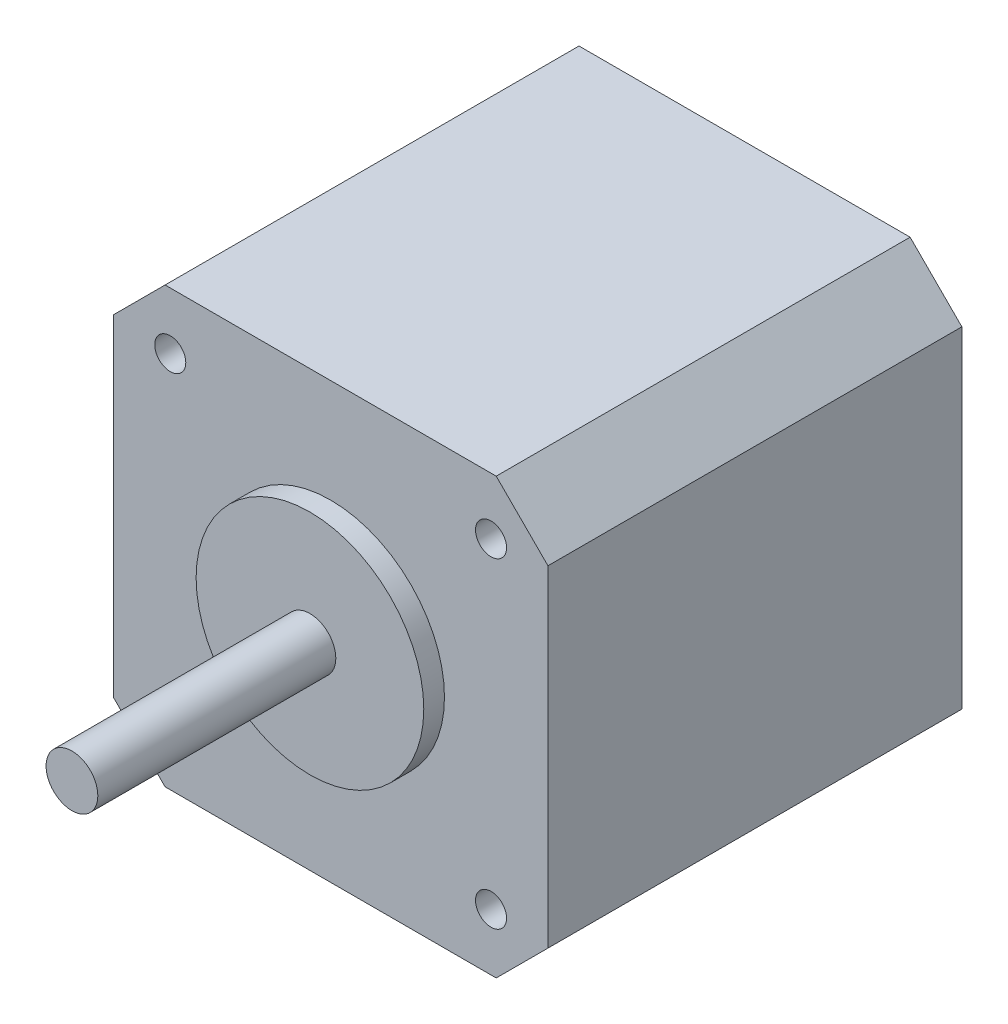
ISO-10303-21;
HEADER;
FILE_DESCRIPTION(('STEP AP214'),'2;1');
FILE_NAME('part.step','',(''),(''),'','','');
FILE_SCHEMA(('AUTOMOTIVE_DESIGN { 1 0 10303 214 1 1 1 1 }'));
ENDSEC;
DATA;
#1=APPLICATION_CONTEXT('core data for automotive mechanical design processes');
#2=APPLICATION_PROTOCOL_DEFINITION('international standard','automotive_design',2000,#1);
#3=PRODUCT_CONTEXT('',#1,'mechanical');
#4=PRODUCT('Part','Part','',(#3));
#5=PRODUCT_RELATED_PRODUCT_CATEGORY('part','',(#4));
#6=PRODUCT_DEFINITION_FORMATION('','',#4);
#7=PRODUCT_DEFINITION_CONTEXT('part definition',#1,'design');
#8=PRODUCT_DEFINITION('design','',#6,#7);
#9=PRODUCT_DEFINITION_SHAPE('','',#8);
#10=(LENGTH_UNIT() NAMED_UNIT(*) SI_UNIT(.MILLI.,.METRE.));
#11=(NAMED_UNIT(*) PLANE_ANGLE_UNIT() SI_UNIT($,.RADIAN.));
#12=(NAMED_UNIT(*) SI_UNIT($,.STERADIAN.) SOLID_ANGLE_UNIT());
#13=UNCERTAINTY_MEASURE_WITH_UNIT(LENGTH_MEASURE(1.E-05),#10,'distance_accuracy_value','');
#14=(GEOMETRIC_REPRESENTATION_CONTEXT(3) GLOBAL_UNCERTAINTY_ASSIGNED_CONTEXT((#13)) GLOBAL_UNIT_ASSIGNED_CONTEXT((#10,
#11,#12)) REPRESENTATION_CONTEXT('',''));
#15=CARTESIAN_POINT('',(0.,0.,0.));
#16=DIRECTION('',(0.,0.,1.));
#17=DIRECTION('',(1.,0.,0.));
#18=AXIS2_PLACEMENT_3D('',#15,#16,#17);
#19=CARTESIAN_POINT('',(-21.,21.,40.));
#20=DIRECTION('',(1.,0.,0.));
#21=DIRECTION('',(0.,0.,-1.));
#22=AXIS2_PLACEMENT_3D('',#19,#20,#21);
#23=PLANE('',#22);
#24=DIRECTION('',(0.,-1.,0.));
#25=VECTOR('',#24,1.);
#26=CARTESIAN_POINT('',(-21.,21.,0.));
#27=LINE('',#26,#25);
#28=CARTESIAN_POINT('',(-21.,16.,0.));
#29=VERTEX_POINT('',#28);
#30=CARTESIAN_POINT('',(-21.,-16.,0.));
#31=VERTEX_POINT('',#30);
#32=EDGE_CURVE('E126',#29,#31,#27,.T.);
#33=ORIENTED_EDGE('',*,*,#32,.T.);
#34=DIRECTION('',(0.,0.,1.));
#35=VECTOR('',#34,1.);
#36=CARTESIAN_POINT('',(-21.,-16.,40.));
#37=LINE('',#36,#35);
#38=CARTESIAN_POINT('',(-21.,-16.,40.));
#39=VERTEX_POINT('',#38);
#40=EDGE_CURVE('E104',#31,#39,#37,.T.);
#41=ORIENTED_EDGE('',*,*,#40,.T.);
#42=DIRECTION('',(0.,-1.,0.));
#43=VECTOR('',#42,1.);
#44=CARTESIAN_POINT('',(-21.,21.,40.));
#45=LINE('',#44,#43);
#46=CARTESIAN_POINT('',(-21.,16.,40.));
#47=VERTEX_POINT('',#46);
#48=EDGE_CURVE('E136',#47,#39,#45,.T.);
#49=ORIENTED_EDGE('',*,*,#48,.F.);
#50=DIRECTION('',(0.,0.,-1.));
#51=VECTOR('',#50,1.);
#52=CARTESIAN_POINT('',(-21.,16.,40.));
#53=LINE('',#52,#51);
#54=EDGE_CURVE('E109',#47,#29,#53,.T.);
#55=ORIENTED_EDGE('',*,*,#54,.T.);
#56=EDGE_LOOP('',(#33,#41,#49,#55));
#57=FACE_BOUND('',#56,.T.);
#58=ADVANCED_FACE('F33',(#57),#23,.F.);
#59=CARTESIAN_POINT('',(-21.,-21.,40.));
#60=DIRECTION('',(0.,1.,0.));
#61=DIRECTION('',(0.,0.,1.));
#62=AXIS2_PLACEMENT_3D('',#59,#60,#61);
#63=PLANE('',#62);
#64=DIRECTION('',(1.,0.,0.));
#65=VECTOR('',#64,1.);
#66=CARTESIAN_POINT('',(-21.,-21.,40.));
#67=LINE('',#66,#65);
#68=CARTESIAN_POINT('',(-16.,-21.,40.));
#69=VERTEX_POINT('',#68);
#70=CARTESIAN_POINT('',(16.,-21.,40.));
#71=VERTEX_POINT('',#70);
#72=EDGE_CURVE('E119',#69,#71,#67,.T.);
#73=ORIENTED_EDGE('',*,*,#72,.F.);
#74=DIRECTION('',(0.,0.,-1.));
#75=VECTOR('',#74,1.);
#76=CARTESIAN_POINT('',(-16.,-21.,40.));
#77=LINE('',#76,#75);
#78=CARTESIAN_POINT('',(-16.,-21.,0.));
#79=VERTEX_POINT('',#78);
#80=EDGE_CURVE('E103',#69,#79,#77,.T.);
#81=ORIENTED_EDGE('',*,*,#80,.T.);
#82=DIRECTION('',(1.,0.,0.));
#83=VECTOR('',#82,1.);
#84=CARTESIAN_POINT('',(-21.,-21.,0.));
#85=LINE('',#84,#83);
#86=CARTESIAN_POINT('',(16.,-21.,0.));
#87=VERTEX_POINT('',#86);
#88=EDGE_CURVE('E116',#79,#87,#85,.T.);
#89=ORIENTED_EDGE('',*,*,#88,.T.);
#90=DIRECTION('',(0.,0.,1.));
#91=VECTOR('',#90,1.);
#92=CARTESIAN_POINT('',(16.,-21.,40.));
#93=LINE('',#92,#91);
#94=EDGE_CURVE('E121',#87,#71,#93,.T.);
#95=ORIENTED_EDGE('',*,*,#94,.T.);
#96=EDGE_LOOP('',(#73,#81,#89,#95));
#97=FACE_BOUND('',#96,.T.);
#98=ADVANCED_FACE('F115',(#97),#63,.F.);
#99=CARTESIAN_POINT('',(21.,21.,40.));
#100=DIRECTION('',(-1.,0.,0.));
#101=DIRECTION('',(0.,0.,1.));
#102=AXIS2_PLACEMENT_3D('',#99,#100,#101);
#103=PLANE('',#102);
#104=DIRECTION('',(0.,1.,0.));
#105=VECTOR('',#104,1.);
#106=CARTESIAN_POINT('',(21.,21.,40.));
#107=LINE('',#106,#105);
#108=CARTESIAN_POINT('',(21.,-16.,40.));
#109=VERTEX_POINT('',#108);
#110=CARTESIAN_POINT('',(21.,16.,40.));
#111=VERTEX_POINT('',#110);
#112=EDGE_CURVE('E162',#109,#111,#107,.T.);
#113=ORIENTED_EDGE('',*,*,#112,.F.);
#114=DIRECTION('',(0.,0.,-1.));
#115=VECTOR('',#114,1.);
#116=CARTESIAN_POINT('',(21.,-16.,40.));
#117=LINE('',#116,#115);
#118=CARTESIAN_POINT('',(21.,-16.,0.));
#119=VERTEX_POINT('',#118);
#120=EDGE_CURVE('E155',#109,#119,#117,.T.);
#121=ORIENTED_EDGE('',*,*,#120,.T.);
#122=DIRECTION('',(0.,1.,0.));
#123=VECTOR('',#122,1.);
#124=CARTESIAN_POINT('',(21.,21.,0.));
#125=LINE('',#124,#123);
#126=CARTESIAN_POINT('',(21.,16.,0.));
#127=VERTEX_POINT('',#126);
#128=EDGE_CURVE('E125',#119,#127,#125,.T.);
#129=ORIENTED_EDGE('',*,*,#128,.T.);
#130=DIRECTION('',(0.,0.,1.));
#131=VECTOR('',#130,1.);
#132=CARTESIAN_POINT('',(21.,16.,40.));
#133=LINE('',#132,#131);
#134=EDGE_CURVE('E153',#127,#111,#133,.T.);
#135=ORIENTED_EDGE('',*,*,#134,.T.);
#136=EDGE_LOOP('',(#113,#121,#129,#135));
#137=FACE_BOUND('',#136,.T.);
#138=ADVANCED_FACE('F160',(#137),#103,.F.);
#139=CARTESIAN_POINT('',(-21.,21.,40.));
#140=DIRECTION('',(0.,-1.,0.));
#141=DIRECTION('',(0.,0.,-1.));
#142=AXIS2_PLACEMENT_3D('',#139,#140,#141);
#143=PLANE('',#142);
#144=DIRECTION('',(-1.,0.,0.));
#145=VECTOR('',#144,1.);
#146=CARTESIAN_POINT('',(-21.,21.,40.));
#147=LINE('',#146,#145);
#148=CARTESIAN_POINT('',(16.,21.,40.));
#149=VERTEX_POINT('',#148);
#150=CARTESIAN_POINT('',(-16.,21.,40.));
#151=VERTEX_POINT('',#150);
#152=EDGE_CURVE('E137',#149,#151,#147,.T.);
#153=ORIENTED_EDGE('',*,*,#152,.F.);
#154=DIRECTION('',(0.,0.,-1.));
#155=VECTOR('',#154,1.);
#156=CARTESIAN_POINT('',(16.,21.,40.));
#157=LINE('',#156,#155);
#158=CARTESIAN_POINT('',(16.,21.,0.));
#159=VERTEX_POINT('',#158);
#160=EDGE_CURVE('E11',#149,#159,#157,.T.);
#161=ORIENTED_EDGE('',*,*,#160,.T.);
#162=DIRECTION('',(-1.,0.,0.));
#163=VECTOR('',#162,1.);
#164=CARTESIAN_POINT('',(-21.,21.,0.));
#165=LINE('',#164,#163);
#166=CARTESIAN_POINT('',(-16.,21.,0.));
#167=VERTEX_POINT('',#166);
#168=EDGE_CURVE('E129',#159,#167,#165,.T.);
#169=ORIENTED_EDGE('',*,*,#168,.T.);
#170=DIRECTION('',(0.,0.,1.));
#171=VECTOR('',#170,1.);
#172=CARTESIAN_POINT('',(-16.,21.,40.));
#173=LINE('',#172,#171);
#174=EDGE_CURVE('E41',#167,#151,#173,.T.);
#175=ORIENTED_EDGE('',*,*,#174,.T.);
#176=EDGE_LOOP('',(#153,#161,#169,#175));
#177=FACE_BOUND('',#176,.T.);
#178=ADVANCED_FACE('F169',(#177),#143,.F.);
#179=CARTESIAN_POINT('',(0.,0.,40.));
#180=DIRECTION('',(0.,0.,1.));
#181=DIRECTION('',(1.,0.,0.));
#182=AXIS2_PLACEMENT_3D('',#179,#180,#181);
#183=PLANE('',#182);
#184=CARTESIAN_POINT('',(-15.5,-15.5,40.));
#185=DIRECTION('',(0.,0.,1.));
#186=DIRECTION('',(-1.,0.,0.));
#187=AXIS2_PLACEMENT_3D('',#184,#185,#186);
#188=CIRCLE('',#187,1.5);
#189=CARTESIAN_POINT('',(-17.,-15.5,40.));
#190=VERTEX_POINT('',#189);
#191=EDGE_CURVE('E206',#190,#190,#188,.T.);
#192=ORIENTED_EDGE('',*,*,#191,.F.);
#193=EDGE_LOOP('',(#192));
#194=FACE_BOUND('',#193,.T.);
#195=CARTESIAN_POINT('',(15.5,-15.5,40.));
#196=DIRECTION('',(0.,0.,1.));
#197=DIRECTION('',(1.,0.,0.));
#198=AXIS2_PLACEMENT_3D('',#195,#196,#197);
#199=CIRCLE('',#198,1.5);
#200=CARTESIAN_POINT('',(17.,-15.5,40.));
#201=VERTEX_POINT('',#200);
#202=EDGE_CURVE('E200',#201,#201,#199,.T.);
#203=ORIENTED_EDGE('',*,*,#202,.F.);
#204=EDGE_LOOP('',(#203));
#205=FACE_BOUND('',#204,.T.);
#206=CARTESIAN_POINT('',(15.5,15.5,40.));
#207=DIRECTION('',(0.,0.,1.));
#208=DIRECTION('',(-1.,0.,0.));
#209=AXIS2_PLACEMENT_3D('',#206,#207,#208);
#210=CIRCLE('',#209,1.5);
#211=CARTESIAN_POINT('',(14.,15.5,40.));
#212=VERTEX_POINT('',#211);
#213=EDGE_CURVE('E194',#212,#212,#210,.T.);
#214=ORIENTED_EDGE('',*,*,#213,.F.);
#215=EDGE_LOOP('',(#214));
#216=FACE_BOUND('',#215,.T.);
#217=CARTESIAN_POINT('',(-15.5,15.5,40.));
#218=DIRECTION('',(0.,0.,1.));
#219=DIRECTION('',(1.,0.,0.));
#220=AXIS2_PLACEMENT_3D('',#217,#218,#219);
#221=CIRCLE('',#220,1.5);
#222=CARTESIAN_POINT('',(-14.,15.5,40.));
#223=VERTEX_POINT('',#222);
#224=EDGE_CURVE('E188',#223,#223,#221,.T.);
#225=ORIENTED_EDGE('',*,*,#224,.F.);
#226=EDGE_LOOP('',(#225));
#227=FACE_BOUND('',#226,.T.);
#228=CARTESIAN_POINT('',(0.,0.,40.));
#229=DIRECTION('',(0.,0.,1.));
#230=DIRECTION('',(1.,0.,0.));
#231=AXIS2_PLACEMENT_3D('',#228,#229,#230);
#232=CIRCLE('',#231,11.);
#233=CARTESIAN_POINT('',(11.,0.,40.));
#234=VERTEX_POINT('',#233);
#235=EDGE_CURVE('E176',#234,#234,#232,.T.);
#236=ORIENTED_EDGE('',*,*,#235,.F.);
#237=EDGE_LOOP('',(#236));
#238=FACE_BOUND('',#237,.T.);
#239=ORIENTED_EDGE('',*,*,#48,.T.);
#240=DIRECTION('',(-0.707106781186547,0.707106781186549,0.));
#241=VECTOR('',#240,1.);
#242=CARTESIAN_POINT('',(-18.5,-18.5,40.));
#243=LINE('',#242,#241);
#244=EDGE_CURVE('E151',#39,#69,#243,.F.);
#245=ORIENTED_EDGE('',*,*,#244,.T.);
#246=ORIENTED_EDGE('',*,*,#72,.T.);
#247=DIRECTION('',(-0.707106781186549,-0.707106781186547,0.));
#248=VECTOR('',#247,1.);
#249=CARTESIAN_POINT('',(18.5,-18.5,40.));
#250=LINE('',#249,#248);
#251=EDGE_CURVE('E149',#71,#109,#250,.F.);
#252=ORIENTED_EDGE('',*,*,#251,.T.);
#253=ORIENTED_EDGE('',*,*,#112,.T.);
#254=DIRECTION('',(0.707106781186547,-0.707106781186549,0.));
#255=VECTOR('',#254,1.);
#256=CARTESIAN_POINT('',(18.5,18.5,40.));
#257=LINE('',#256,#255);
#258=EDGE_CURVE('E54',#111,#149,#257,.F.);
#259=ORIENTED_EDGE('',*,*,#258,.T.);
#260=ORIENTED_EDGE('',*,*,#152,.T.);
#261=DIRECTION('',(0.707106781186549,0.707106781186547,0.));
#262=VECTOR('',#261,1.);
#263=CARTESIAN_POINT('',(-18.5,18.5,40.));
#264=LINE('',#263,#262);
#265=EDGE_CURVE('E146',#151,#47,#264,.F.);
#266=ORIENTED_EDGE('',*,*,#265,.T.);
#267=EDGE_LOOP('',(#239,#245,#246,#252,#253,#259,#260,#266));
#268=FACE_BOUND('',#267,.T.);
#269=ADVANCED_FACE('F221',(#194,#205,#216,#227,#238,#268),#183,.T.);
#270=CARTESIAN_POINT('',(0.,0.,0.));
#271=DIRECTION('',(0.,0.,1.));
#272=DIRECTION('',(1.,0.,0.));
#273=AXIS2_PLACEMENT_3D('',#270,#271,#272);
#274=PLANE('',#273);
#275=ORIENTED_EDGE('',*,*,#88,.F.);
#276=DIRECTION('',(0.707106781186547,-0.707106781186549,0.));
#277=VECTOR('',#276,1.);
#278=CARTESIAN_POINT('',(-16.,-21.,0.));
#279=LINE('',#278,#277);
#280=EDGE_CURVE('E99',#79,#31,#279,.F.);
#281=ORIENTED_EDGE('',*,*,#280,.T.);
#282=ORIENTED_EDGE('',*,*,#32,.F.);
#283=DIRECTION('',(-0.707106781186549,-0.707106781186547,0.));
#284=VECTOR('',#283,1.);
#285=CARTESIAN_POINT('',(-21.,16.,0.));
#286=LINE('',#285,#284);
#287=EDGE_CURVE('E120',#29,#167,#286,.F.);
#288=ORIENTED_EDGE('',*,*,#287,.T.);
#289=ORIENTED_EDGE('',*,*,#168,.F.);
#290=DIRECTION('',(-0.707106781186547,0.707106781186549,0.));
#291=VECTOR('',#290,1.);
#292=CARTESIAN_POINT('',(16.,21.,0.));
#293=LINE('',#292,#291);
#294=EDGE_CURVE('E140',#159,#127,#293,.F.);
#295=ORIENTED_EDGE('',*,*,#294,.T.);
#296=ORIENTED_EDGE('',*,*,#128,.F.);
#297=DIRECTION('',(0.707106781186549,0.707106781186547,0.));
#298=VECTOR('',#297,1.);
#299=CARTESIAN_POINT('',(21.,-16.,0.));
#300=LINE('',#299,#298);
#301=EDGE_CURVE('E110',#119,#87,#300,.F.);
#302=ORIENTED_EDGE('',*,*,#301,.T.);
#303=EDGE_LOOP('',(#275,#281,#282,#288,#289,#295,#296,#302));
#304=FACE_BOUND('',#303,.T.);
#305=ADVANCED_FACE('F123',(#304),#274,.F.);
#306=CARTESIAN_POINT('',(-16.,-21.,40.));
#307=DIRECTION('',(0.707106781186549,0.707106781186547,0.));
#308=DIRECTION('',(0.,0.,-1.));
#309=AXIS2_PLACEMENT_3D('',#306,#307,#308);
#310=PLANE('',#309);
#311=ORIENTED_EDGE('',*,*,#244,.F.);
#312=ORIENTED_EDGE('',*,*,#40,.F.);
#313=ORIENTED_EDGE('',*,*,#280,.F.);
#314=ORIENTED_EDGE('',*,*,#80,.F.);
#315=EDGE_LOOP('',(#311,#312,#313,#314));
#316=FACE_BOUND('',#315,.T.);
#317=ADVANCED_FACE('F102',(#316),#310,.F.);
#318=CARTESIAN_POINT('',(21.,-16.,40.));
#319=DIRECTION('',(-0.707106781186547,0.707106781186549,0.));
#320=DIRECTION('',(0.,0.,-1.));
#321=AXIS2_PLACEMENT_3D('',#318,#319,#320);
#322=PLANE('',#321);
#323=ORIENTED_EDGE('',*,*,#251,.F.);
#324=ORIENTED_EDGE('',*,*,#94,.F.);
#325=ORIENTED_EDGE('',*,*,#301,.F.);
#326=ORIENTED_EDGE('',*,*,#120,.F.);
#327=EDGE_LOOP('',(#323,#324,#325,#326));
#328=FACE_BOUND('',#327,.T.);
#329=ADVANCED_FACE('F245',(#328),#322,.F.);
#330=CARTESIAN_POINT('',(16.,21.,40.));
#331=DIRECTION('',(-0.707106781186549,-0.707106781186547,0.));
#332=DIRECTION('',(0.,0.,-1.));
#333=AXIS2_PLACEMENT_3D('',#330,#331,#332);
#334=PLANE('',#333);
#335=ORIENTED_EDGE('',*,*,#258,.F.);
#336=ORIENTED_EDGE('',*,*,#134,.F.);
#337=ORIENTED_EDGE('',*,*,#294,.F.);
#338=ORIENTED_EDGE('',*,*,#160,.F.);
#339=EDGE_LOOP('',(#335,#336,#337,#338));
#340=FACE_BOUND('',#339,.T.);
#341=ADVANCED_FACE('F168',(#340),#334,.F.);
#342=CARTESIAN_POINT('',(-21.,16.,40.));
#343=DIRECTION('',(0.707106781186547,-0.707106781186549,0.));
#344=DIRECTION('',(0.,0.,-1.));
#345=AXIS2_PLACEMENT_3D('',#342,#343,#344);
#346=PLANE('',#345);
#347=ORIENTED_EDGE('',*,*,#265,.F.);
#348=ORIENTED_EDGE('',*,*,#174,.F.);
#349=ORIENTED_EDGE('',*,*,#287,.F.);
#350=ORIENTED_EDGE('',*,*,#54,.F.);
#351=EDGE_LOOP('',(#347,#348,#349,#350));
#352=FACE_BOUND('',#351,.T.);
#353=ADVANCED_FACE('F35',(#352),#346,.F.);
#354=CARTESIAN_POINT('',(0.,0.,42.));
#355=DIRECTION('',(0.,0.,-1.));
#356=DIRECTION('',(-1.,0.,0.));
#357=AXIS2_PLACEMENT_3D('',#354,#355,#356);
#358=CYLINDRICAL_SURFACE('',#357,11.);
#359=CARTESIAN_POINT('',(0.,0.,42.));
#360=DIRECTION('',(0.,0.,1.));
#361=DIRECTION('',(1.,0.,0.));
#362=AXIS2_PLACEMENT_3D('',#359,#360,#361);
#363=CIRCLE('',#362,11.);
#364=CARTESIAN_POINT('',(11.,0.,42.));
#365=VERTEX_POINT('',#364);
#366=EDGE_CURVE('E131',#365,#365,#363,.T.);
#367=ORIENTED_EDGE('',*,*,#366,.F.);
#368=EDGE_LOOP('',(#367));
#369=FACE_BOUND('',#368,.T.);
#370=ORIENTED_EDGE('',*,*,#235,.T.);
#371=EDGE_LOOP('',(#370));
#372=FACE_BOUND('',#371,.T.);
#373=ADVANCED_FACE('F237',(#369,#372),#358,.T.);
#374=CARTESIAN_POINT('',(0.,0.,42.));
#375=DIRECTION('',(0.,0.,1.));
#376=DIRECTION('',(1.,0.,0.));
#377=AXIS2_PLACEMENT_3D('',#374,#375,#376);
#378=PLANE('',#377);
#379=CARTESIAN_POINT('',(0.,0.,42.));
#380=DIRECTION('',(0.,0.,1.));
#381=DIRECTION('',(1.,0.,0.));
#382=AXIS2_PLACEMENT_3D('',#379,#380,#381);
#383=CIRCLE('',#382,2.5);
#384=CARTESIAN_POINT('',(2.5,0.,42.));
#385=VERTEX_POINT('',#384);
#386=EDGE_CURVE('E182',#385,#385,#383,.T.);
#387=ORIENTED_EDGE('',*,*,#386,.F.);
#388=EDGE_LOOP('',(#387));
#389=FACE_BOUND('',#388,.T.);
#390=ORIENTED_EDGE('',*,*,#366,.T.);
#391=EDGE_LOOP('',(#390));
#392=FACE_BOUND('',#391,.T.);
#393=ADVANCED_FACE('F242',(#389,#392),#378,.T.);
#394=CARTESIAN_POINT('',(0.,0.,65.));
#395=DIRECTION('',(0.,0.,-1.));
#396=DIRECTION('',(-1.,0.,0.));
#397=AXIS2_PLACEMENT_3D('',#394,#395,#396);
#398=CYLINDRICAL_SURFACE('',#397,2.5);
#399=CARTESIAN_POINT('',(0.,0.,65.));
#400=DIRECTION('',(0.,0.,1.));
#401=DIRECTION('',(1.,0.,0.));
#402=AXIS2_PLACEMENT_3D('',#399,#400,#401);
#403=CIRCLE('',#402,2.5);
#404=CARTESIAN_POINT('',(2.5,0.,65.));
#405=VERTEX_POINT('',#404);
#406=EDGE_CURVE('E179',#405,#405,#403,.T.);
#407=ORIENTED_EDGE('',*,*,#406,.F.);
#408=EDGE_LOOP('',(#407));
#409=FACE_BOUND('',#408,.T.);
#410=ORIENTED_EDGE('',*,*,#386,.T.);
#411=EDGE_LOOP('',(#410));
#412=FACE_BOUND('',#411,.T.);
#413=ADVANCED_FACE('F285',(#409,#412),#398,.T.);
#414=CARTESIAN_POINT('',(0.,0.,65.));
#415=DIRECTION('',(0.,0.,1.));
#416=DIRECTION('',(1.,0.,0.));
#417=AXIS2_PLACEMENT_3D('',#414,#415,#416);
#418=PLANE('',#417);
#419=ORIENTED_EDGE('',*,*,#406,.T.);
#420=EDGE_LOOP('',(#419));
#421=FACE_BOUND('',#420,.T.);
#422=ADVANCED_FACE('F295',(#421),#418,.T.);
#423=CARTESIAN_POINT('',(-15.5,15.5,37.));
#424=DIRECTION('',(0.,0.,1.));
#425=DIRECTION('',(1.,0.,0.));
#426=AXIS2_PLACEMENT_3D('',#423,#424,#425);
#427=CYLINDRICAL_SURFACE('',#426,1.5);
#428=CARTESIAN_POINT('',(-15.5,15.5,37.));
#429=DIRECTION('',(0.,0.,1.));
#430=DIRECTION('',(1.,0.,0.));
#431=AXIS2_PLACEMENT_3D('',#428,#429,#430);
#432=CIRCLE('',#431,1.5);
#433=CARTESIAN_POINT('',(-14.,15.5,37.));
#434=VERTEX_POINT('',#433);
#435=EDGE_CURVE('E185',#434,#434,#432,.T.);
#436=ORIENTED_EDGE('',*,*,#435,.F.);
#437=EDGE_LOOP('',(#436));
#438=FACE_BOUND('',#437,.T.);
#439=ORIENTED_EDGE('',*,*,#224,.T.);
#440=EDGE_LOOP('',(#439));
#441=FACE_BOUND('',#440,.T.);
#442=ADVANCED_FACE('F305',(#438,#441),#427,.F.);
#443=CARTESIAN_POINT('',(-15.5,15.5,37.));
#444=DIRECTION('',(0.,0.,1.));
#445=DIRECTION('',(1.,0.,0.));
#446=AXIS2_PLACEMENT_3D('',#443,#444,#445);
#447=PLANE('',#446);
#448=ORIENTED_EDGE('',*,*,#435,.T.);
#449=EDGE_LOOP('',(#448));
#450=FACE_BOUND('',#449,.T.);
#451=ADVANCED_FACE('F324',(#450),#447,.T.);
#452=CARTESIAN_POINT('',(15.5,15.5,37.));
#453=DIRECTION('',(0.,0.,1.));
#454=DIRECTION('',(1.,0.,0.));
#455=AXIS2_PLACEMENT_3D('',#452,#453,#454);
#456=CYLINDRICAL_SURFACE('',#455,1.5);
#457=CARTESIAN_POINT('',(15.5,15.5,37.));
#458=DIRECTION('',(0.,0.,1.));
#459=DIRECTION('',(-1.,0.,0.));
#460=AXIS2_PLACEMENT_3D('',#457,#458,#459);
#461=CIRCLE('',#460,1.5);
#462=CARTESIAN_POINT('',(14.,15.5,37.));
#463=VERTEX_POINT('',#462);
#464=EDGE_CURVE('E197',#463,#463,#461,.T.);
#465=ORIENTED_EDGE('',*,*,#464,.F.);
#466=EDGE_LOOP('',(#465));
#467=FACE_BOUND('',#466,.T.);
#468=ORIENTED_EDGE('',*,*,#213,.T.);
#469=EDGE_LOOP('',(#468));
#470=FACE_BOUND('',#469,.T.);
#471=ADVANCED_FACE('F334',(#467,#470),#456,.F.);
#472=CARTESIAN_POINT('',(15.5,15.5,37.));
#473=DIRECTION('',(0.,0.,-1.));
#474=DIRECTION('',(-1.,0.,0.));
#475=AXIS2_PLACEMENT_3D('',#472,#473,#474);
#476=PLANE('',#475);
#477=ORIENTED_EDGE('',*,*,#464,.T.);
#478=EDGE_LOOP('',(#477));
#479=FACE_BOUND('',#478,.T.);
#480=ADVANCED_FACE('F344',(#479),#476,.F.);
#481=CARTESIAN_POINT('',(15.5,-15.5,37.));
#482=DIRECTION('',(0.,0.,1.));
#483=DIRECTION('',(1.,0.,0.));
#484=AXIS2_PLACEMENT_3D('',#481,#482,#483);
#485=CYLINDRICAL_SURFACE('',#484,1.5);
#486=CARTESIAN_POINT('',(15.5,-15.5,37.));
#487=DIRECTION('',(0.,0.,1.));
#488=DIRECTION('',(1.,0.,0.));
#489=AXIS2_PLACEMENT_3D('',#486,#487,#488);
#490=CIRCLE('',#489,1.5);
#491=CARTESIAN_POINT('',(17.,-15.5,37.));
#492=VERTEX_POINT('',#491);
#493=EDGE_CURVE('E203',#492,#492,#490,.T.);
#494=ORIENTED_EDGE('',*,*,#493,.F.);
#495=EDGE_LOOP('',(#494));
#496=FACE_BOUND('',#495,.T.);
#497=ORIENTED_EDGE('',*,*,#202,.T.);
#498=EDGE_LOOP('',(#497));
#499=FACE_BOUND('',#498,.T.);
#500=ADVANCED_FACE('F354',(#496,#499),#485,.F.);
#501=CARTESIAN_POINT('',(15.5,-15.5,37.));
#502=DIRECTION('',(0.,0.,1.));
#503=DIRECTION('',(1.,0.,0.));
#504=AXIS2_PLACEMENT_3D('',#501,#502,#503);
#505=PLANE('',#504);
#506=ORIENTED_EDGE('',*,*,#493,.T.);
#507=EDGE_LOOP('',(#506));
#508=FACE_BOUND('',#507,.T.);
#509=ADVANCED_FACE('F217',(#508),#505,.T.);
#510=CARTESIAN_POINT('',(-15.5,-15.5,37.));
#511=DIRECTION('',(0.,0.,1.));
#512=DIRECTION('',(1.,0.,0.));
#513=AXIS2_PLACEMENT_3D('',#510,#511,#512);
#514=CYLINDRICAL_SURFACE('',#513,1.5);
#515=CARTESIAN_POINT('',(-15.5,-15.5,37.));
#516=DIRECTION('',(0.,0.,1.));
#517=DIRECTION('',(-1.,0.,0.));
#518=AXIS2_PLACEMENT_3D('',#515,#516,#517);
#519=CIRCLE('',#518,1.5);
#520=CARTESIAN_POINT('',(-17.,-15.5,37.));
#521=VERTEX_POINT('',#520);
#522=EDGE_CURVE('E191',#521,#521,#519,.T.);
#523=ORIENTED_EDGE('',*,*,#522,.F.);
#524=EDGE_LOOP('',(#523));
#525=FACE_BOUND('',#524,.T.);
#526=ORIENTED_EDGE('',*,*,#191,.T.);
#527=EDGE_LOOP('',(#526));
#528=FACE_BOUND('',#527,.T.);
#529=ADVANCED_FACE('F214',(#525,#528),#514,.F.);
#530=CARTESIAN_POINT('',(-15.5,-15.5,37.));
#531=DIRECTION('',(0.,0.,-1.));
#532=DIRECTION('',(-1.,0.,0.));
#533=AXIS2_PLACEMENT_3D('',#530,#531,#532);
#534=PLANE('',#533);
#535=ORIENTED_EDGE('',*,*,#522,.T.);
#536=EDGE_LOOP('',(#535));
#537=FACE_BOUND('',#536,.T.);
#538=ADVANCED_FACE('F212',(#537),#534,.F.);
#539=CLOSED_SHELL('',(#58,#98,#138,#178,#269,#305,#317,#329,#341,#353,#373,#393,#413,#422,#442,
#451,#471,#480,#500,#509,#529,#538));
#540=MANIFOLD_SOLID_BREP('B2',#539);
#541=ADVANCED_BREP_SHAPE_REPRESENTATION('',(#18,#540),#14);
#542=SHAPE_DEFINITION_REPRESENTATION(#9,#541);
ENDSEC;
END-ISO-10303-21;
